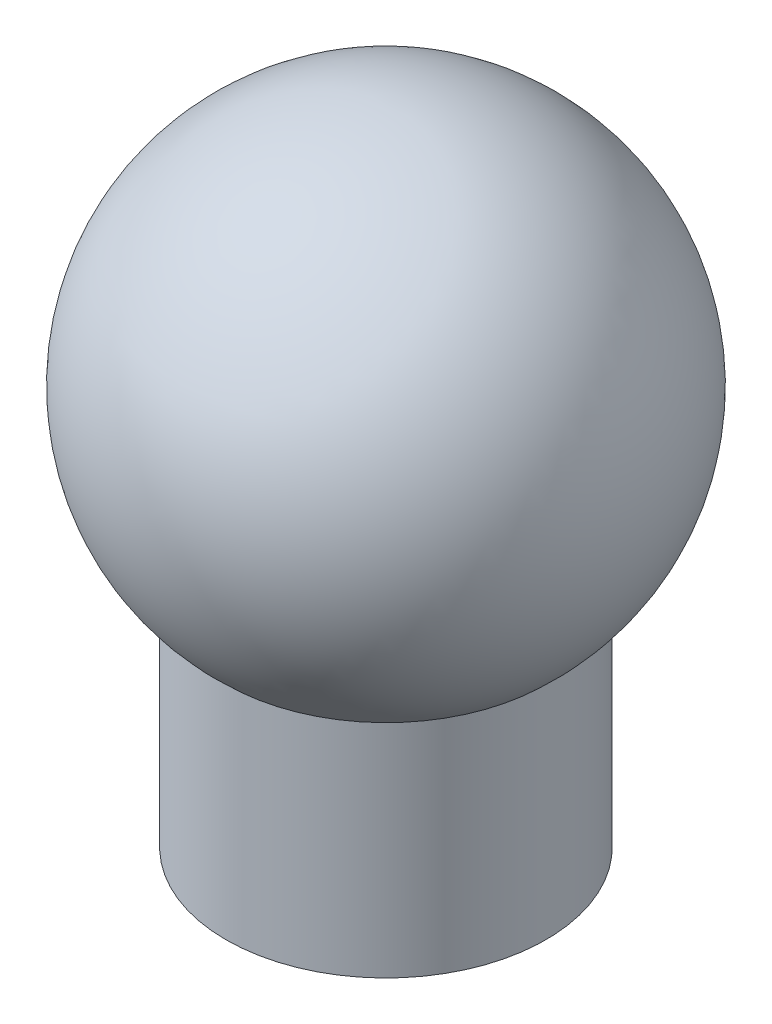
ISO-10303-21;
HEADER;
FILE_DESCRIPTION(('STEP AP214'),'2;1');
FILE_NAME('part.step','',(''),(''),'','','');
FILE_SCHEMA(('AUTOMOTIVE_DESIGN { 1 0 10303 214 1 1 1 1 }'));
ENDSEC;
DATA;
#1=APPLICATION_CONTEXT('core data for automotive mechanical design processes');
#2=APPLICATION_PROTOCOL_DEFINITION('international standard','automotive_design',2000,#1);
#3=PRODUCT_CONTEXT('',#1,'mechanical');
#4=PRODUCT('Part','Part','',(#3));
#5=PRODUCT_RELATED_PRODUCT_CATEGORY('part','',(#4));
#6=PRODUCT_DEFINITION_FORMATION('','',#4);
#7=PRODUCT_DEFINITION_CONTEXT('part definition',#1,'design');
#8=PRODUCT_DEFINITION('design','',#6,#7);
#9=PRODUCT_DEFINITION_SHAPE('','',#8);
#10=(LENGTH_UNIT() NAMED_UNIT(*) SI_UNIT(.MILLI.,.METRE.));
#11=(NAMED_UNIT(*) PLANE_ANGLE_UNIT() SI_UNIT($,.RADIAN.));
#12=(NAMED_UNIT(*) SI_UNIT($,.STERADIAN.) SOLID_ANGLE_UNIT());
#13=UNCERTAINTY_MEASURE_WITH_UNIT(LENGTH_MEASURE(1.E-05),#10,'distance_accuracy_value','');
#14=(GEOMETRIC_REPRESENTATION_CONTEXT(3) GLOBAL_UNCERTAINTY_ASSIGNED_CONTEXT((#13)) GLOBAL_UNIT_ASSIGNED_CONTEXT((#10,
#11,#12)) REPRESENTATION_CONTEXT('',''));
#15=CARTESIAN_POINT('',(0.,0.,0.));
#16=DIRECTION('',(0.,0.,1.));
#17=DIRECTION('',(1.,0.,0.));
#18=AXIS2_PLACEMENT_3D('',#15,#16,#17);
#19=CARTESIAN_POINT('',(12.,0.,0.));
#20=DIRECTION('',(-1.,0.,0.));
#21=DIRECTION('',(0.,0.,-1.));
#22=AXIS2_PLACEMENT_3D('',#19,#20,#21);
#23=SPHERICAL_SURFACE('',#22,12.);
#24=CARTESIAN_POINT('',(12.,0.,0.));
#25=DIRECTION('',(0.,1.,0.));
#26=DIRECTION('',(0.,0.,1.));
#27=AXIS2_PLACEMENT_3D('',#24,#25,#26);
#28=SPHERICAL_SURFACE('',#27,12.);
#29=CARTESIAN_POINT('',(12.,-8.94427190999916,0.));
#30=DIRECTION('',(0.,1.,0.));
#31=DIRECTION('',(0.,0.,1.));
#32=AXIS2_PLACEMENT_3D('',#29,#30,#31);
#33=CIRCLE('',#32,8.);
#34=CARTESIAN_POINT('',(12.,-8.94427190999916,8.));
#35=VERTEX_POINT('',#34);
#36=EDGE_CURVE('E10',#35,#35,#33,.F.);
#37=ORIENTED_EDGE('',*,*,#36,.F.);
#38=EDGE_LOOP('',(#37));
#39=FACE_BOUND('',#38,.T.);
#40=ADVANCED_FACE('F37',(#39),#28,.T.);
#41=CARTESIAN_POINT('',(12.,12.001,0.));
#42=DIRECTION('',(0.,-1.,0.));
#43=DIRECTION('',(0.,0.,-1.));
#44=AXIS2_PLACEMENT_3D('',#41,#42,#43);
#45=CYLINDRICAL_SURFACE('',#44,8.);
#46=CARTESIAN_POINT('',(12.,-20.,0.));
#47=DIRECTION('',(0.,1.,0.));
#48=DIRECTION('',(0.,0.,1.));
#49=AXIS2_PLACEMENT_3D('',#46,#47,#48);
#50=CIRCLE('',#49,8.);
#51=CARTESIAN_POINT('',(12.,-20.,8.));
#52=VERTEX_POINT('',#51);
#53=EDGE_CURVE('E44',#52,#52,#50,.T.);
#54=ORIENTED_EDGE('',*,*,#53,.T.);
#55=EDGE_LOOP('',(#54));
#56=FACE_BOUND('',#55,.T.);
#57=ORIENTED_EDGE('',*,*,#36,.T.);
#58=EDGE_LOOP('',(#57));
#59=FACE_BOUND('',#58,.T.);
#60=ADVANCED_FACE('F95',(#56,#59),#45,.T.);
#61=CARTESIAN_POINT('',(12.,-20.,0.));
#62=DIRECTION('',(0.,1.,0.));
#63=DIRECTION('',(0.,0.,1.));
#64=AXIS2_PLACEMENT_3D('',#61,#62,#63);
#65=PLANE('',#64);
#66=CARTESIAN_POINT('',(12.,-20.,0.));
#67=DIRECTION('',(0.,-1.,0.));
#68=DIRECTION('',(0.,0.,-1.));
#69=AXIS2_PLACEMENT_3D('',#66,#67,#68);
#70=CIRCLE('',#69,6.);
#71=CARTESIAN_POINT('',(12.,-20.,-6.));
#72=VERTEX_POINT('',#71);
#73=EDGE_CURVE('E56',#72,#72,#70,.T.);
#74=ORIENTED_EDGE('',*,*,#73,.F.);
#75=EDGE_LOOP('',(#74));
#76=FACE_BOUND('',#75,.T.);
#77=ORIENTED_EDGE('',*,*,#53,.F.);
#78=EDGE_LOOP('',(#77));
#79=FACE_BOUND('',#78,.T.);
#80=ADVANCED_FACE('F89',(#76,#79),#65,.F.);
#81=CARTESIAN_POINT('',(12.,-18.,0.));
#82=DIRECTION('',(0.,-1.,0.));
#83=DIRECTION('',(0.,0.,-1.));
#84=AXIS2_PLACEMENT_3D('',#81,#82,#83);
#85=CYLINDRICAL_SURFACE('',#84,6.);
#86=CARTESIAN_POINT('',(12.,-18.,0.));
#87=DIRECTION('',(0.,-1.,0.));
#88=DIRECTION('',(0.,0.,-1.));
#89=AXIS2_PLACEMENT_3D('',#86,#87,#88);
#90=CIRCLE('',#89,6.);
#91=CARTESIAN_POINT('',(12.,-18.,-6.));
#92=VERTEX_POINT('',#91);
#93=EDGE_CURVE('E50',#92,#92,#90,.T.);
#94=ORIENTED_EDGE('',*,*,#93,.F.);
#95=EDGE_LOOP('',(#94));
#96=FACE_BOUND('',#95,.T.);
#97=ORIENTED_EDGE('',*,*,#73,.T.);
#98=EDGE_LOOP('',(#97));
#99=FACE_BOUND('',#98,.T.);
#100=ADVANCED_FACE('F83',(#96,#99),#85,.F.);
#101=CARTESIAN_POINT('',(12.,-18.,0.));
#102=DIRECTION('',(0.,-1.,0.));
#103=DIRECTION('',(0.,0.,-1.));
#104=AXIS2_PLACEMENT_3D('',#101,#102,#103);
#105=PLANE('',#104);
#106=CARTESIAN_POINT('',(12.,-18.,0.));
#107=DIRECTION('',(0.,-1.,0.));
#108=DIRECTION('',(0.,0.,-1.));
#109=AXIS2_PLACEMENT_3D('',#106,#107,#108);
#110=CIRCLE('',#109,5.);
#111=CARTESIAN_POINT('',(12.,-18.,-5.));
#112=VERTEX_POINT('',#111);
#113=EDGE_CURVE('E63',#112,#112,#110,.T.);
#114=ORIENTED_EDGE('',*,*,#113,.F.);
#115=EDGE_LOOP('',(#114));
#116=FACE_BOUND('',#115,.T.);
#117=ORIENTED_EDGE('',*,*,#93,.T.);
#118=EDGE_LOOP('',(#117));
#119=FACE_BOUND('',#118,.T.);
#120=ADVANCED_FACE('F77',(#116,#119),#105,.T.);
#121=CARTESIAN_POINT('',(12.,-13.,0.));
#122=DIRECTION('',(0.,-1.,0.));
#123=DIRECTION('',(0.,0.,-1.));
#124=AXIS2_PLACEMENT_3D('',#121,#122,#123);
#125=CYLINDRICAL_SURFACE('',#124,5.);
#126=CARTESIAN_POINT('',(12.,-13.,0.));
#127=DIRECTION('',(0.,-1.,0.));
#128=DIRECTION('',(0.,0.,-1.));
#129=AXIS2_PLACEMENT_3D('',#126,#127,#128);
#130=CIRCLE('',#129,5.);
#131=CARTESIAN_POINT('',(12.,-13.,-5.));
#132=VERTEX_POINT('',#131);
#133=EDGE_CURVE('E61',#132,#132,#130,.T.);
#134=ORIENTED_EDGE('',*,*,#133,.F.);
#135=EDGE_LOOP('',(#134));
#136=FACE_BOUND('',#135,.T.);
#137=ORIENTED_EDGE('',*,*,#113,.T.);
#138=EDGE_LOOP('',(#137));
#139=FACE_BOUND('',#138,.T.);
#140=ADVANCED_FACE('F74',(#136,#139),#125,.F.);
#141=CARTESIAN_POINT('',(12.,-13.,0.));
#142=DIRECTION('',(0.,-1.,0.));
#143=DIRECTION('',(0.,0.,-1.));
#144=AXIS2_PLACEMENT_3D('',#141,#142,#143);
#145=PLANE('',#144);
#146=ORIENTED_EDGE('',*,*,#133,.T.);
#147=EDGE_LOOP('',(#146));
#148=FACE_BOUND('',#147,.T.);
#149=ADVANCED_FACE('F72',(#148),#145,.T.);
#150=CLOSED_SHELL('',(#40,#60,#80,#100,#120,#140,#149));
#151=MANIFOLD_SOLID_BREP('B2',#150);
#152=ADVANCED_BREP_SHAPE_REPRESENTATION('',(#18,#151),#14);
#153=SHAPE_DEFINITION_REPRESENTATION(#9,#152);
ENDSEC;
END-ISO-10303-21;
